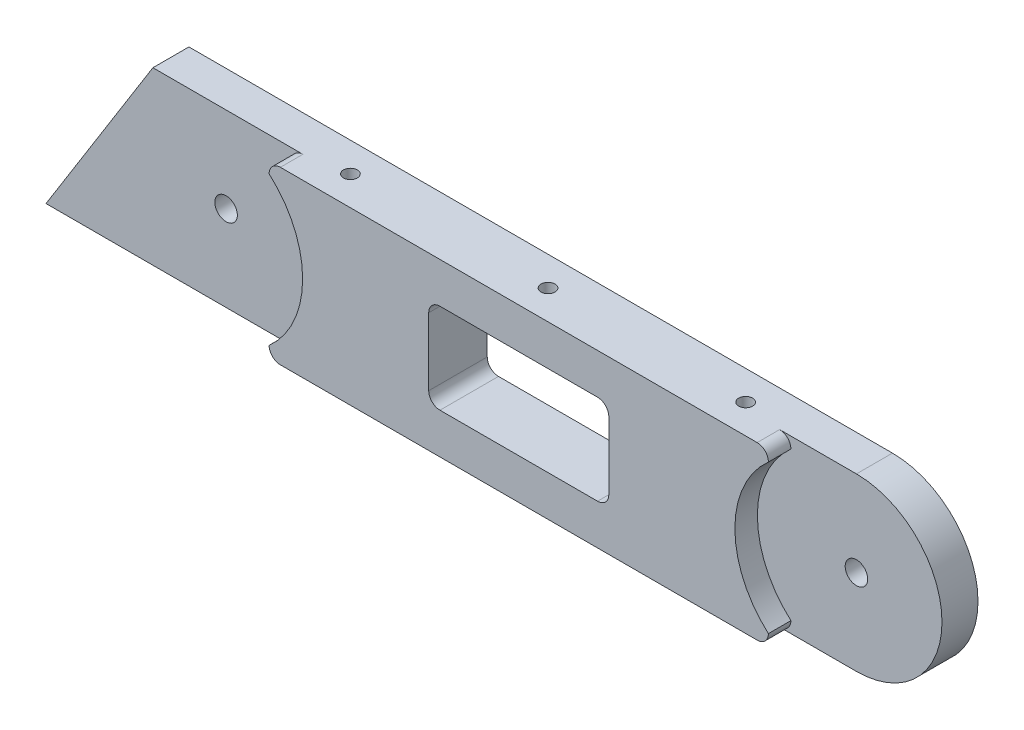
ISO-10303-21;
HEADER;
FILE_DESCRIPTION(('STEP AP214'),'2;1');
FILE_NAME('part.step','',(''),(''),'','','');
FILE_SCHEMA(('AUTOMOTIVE_DESIGN { 1 0 10303 214 1 1 1 1 }'));
ENDSEC;
DATA;
#1=APPLICATION_CONTEXT('core data for automotive mechanical design processes');
#2=APPLICATION_PROTOCOL_DEFINITION('international standard','automotive_design',2000,#1);
#3=PRODUCT_CONTEXT('',#1,'mechanical');
#4=PRODUCT('Part','Part','',(#3));
#5=PRODUCT_RELATED_PRODUCT_CATEGORY('part','',(#4));
#6=PRODUCT_DEFINITION_FORMATION('','',#4);
#7=PRODUCT_DEFINITION_CONTEXT('part definition',#1,'design');
#8=PRODUCT_DEFINITION('design','',#6,#7);
#9=PRODUCT_DEFINITION_SHAPE('','',#8);
#10=(LENGTH_UNIT() NAMED_UNIT(*) SI_UNIT(.MILLI.,.METRE.));
#11=(NAMED_UNIT(*) PLANE_ANGLE_UNIT() SI_UNIT($,.RADIAN.));
#12=(NAMED_UNIT(*) SI_UNIT($,.STERADIAN.) SOLID_ANGLE_UNIT());
#13=UNCERTAINTY_MEASURE_WITH_UNIT(LENGTH_MEASURE(1.E-05),#10,'distance_accuracy_value','');
#14=(GEOMETRIC_REPRESENTATION_CONTEXT(3) GLOBAL_UNCERTAINTY_ASSIGNED_CONTEXT((#13)) GLOBAL_UNIT_ASSIGNED_CONTEXT((#10,
#11,#12)) REPRESENTATION_CONTEXT('',''));
#15=CARTESIAN_POINT('',(0.,0.,0.));
#16=DIRECTION('',(0.,0.,1.));
#17=DIRECTION('',(1.,0.,0.));
#18=AXIS2_PLACEMENT_3D('',#15,#16,#17);
#19=CARTESIAN_POINT('',(-32.9483677891447,16.5,13.));
#20=DIRECTION('',(0.,0.,1.));
#21=DIRECTION('',(1.,0.,0.));
#22=AXIS2_PLACEMENT_3D('',#19,#20,#21);
#23=PLANE('',#22);
#24=CARTESIAN_POINT('',(-50.,0.,13.));
#25=DIRECTION('',(0.,0.,1.));
#26=DIRECTION('',(1.,0.,0.));
#27=AXIS2_PLACEMENT_3D('',#24,#25,#26);
#28=CIRCLE('',#27,22.);
#29=CARTESIAN_POINT('',(-35.4483677891447,-16.5,13.));
#30=VERTEX_POINT('',#29);
#31=CARTESIAN_POINT('',(-35.4483677891447,16.5,13.));
#32=VERTEX_POINT('',#31);
#33=EDGE_CURVE('E182',#30,#32,#28,.T.);
#34=ORIENTED_EDGE('',*,*,#33,.F.);
#35=CARTESIAN_POINT('',(-32.9483677891447,-16.5,13.));
#36=DIRECTION('',(0.,0.,-1.));
#37=DIRECTION('',(-1.,0.,0.));
#38=AXIS2_PLACEMENT_3D('',#35,#36,#37);
#39=CIRCLE('',#38,2.5);
#40=CARTESIAN_POINT('',(-32.9483677891447,-19.,13.));
#41=VERTEX_POINT('',#40);
#42=EDGE_CURVE('E195',#41,#30,#39,.T.);
#43=ORIENTED_EDGE('',*,*,#42,.F.);
#44=DIRECTION('',(1.,0.,0.));
#45=VECTOR('',#44,1.);
#46=CARTESIAN_POINT('',(-32.9483677891447,-19.,13.));
#47=LINE('',#46,#45);
#48=CARTESIAN_POINT('',(72.9483677891448,-19.,13.));
#49=VERTEX_POINT('',#48);
#50=EDGE_CURVE('E204',#41,#49,#47,.T.);
#51=ORIENTED_EDGE('',*,*,#50,.T.);
#52=CARTESIAN_POINT('',(72.9483677891448,-16.5,13.));
#53=DIRECTION('',(0.,0.,1.));
#54=DIRECTION('',(1.,0.,0.));
#55=AXIS2_PLACEMENT_3D('',#52,#53,#54);
#56=CIRCLE('',#55,2.5);
#57=CARTESIAN_POINT('',(75.4483677891448,-16.5,13.));
#58=VERTEX_POINT('',#57);
#59=EDGE_CURVE('E206',#49,#58,#56,.T.);
#60=ORIENTED_EDGE('',*,*,#59,.T.);
#61=CARTESIAN_POINT('',(90.,0.,13.));
#62=DIRECTION('',(0.,0.,1.));
#63=DIRECTION('',(1.,0.,0.));
#64=AXIS2_PLACEMENT_3D('',#61,#62,#63);
#65=CIRCLE('',#64,22.);
#66=CARTESIAN_POINT('',(75.4483677891448,16.5,13.));
#67=VERTEX_POINT('',#66);
#68=EDGE_CURVE('E200',#67,#58,#65,.T.);
#69=ORIENTED_EDGE('',*,*,#68,.F.);
#70=CARTESIAN_POINT('',(72.9483677891448,16.5,13.));
#71=DIRECTION('',(0.,0.,1.));
#72=DIRECTION('',(1.,0.,0.));
#73=AXIS2_PLACEMENT_3D('',#70,#71,#72);
#74=CIRCLE('',#73,2.5);
#75=CARTESIAN_POINT('',(72.9483677891448,19.,13.));
#76=VERTEX_POINT('',#75);
#77=EDGE_CURVE('E214',#67,#76,#74,.T.);
#78=ORIENTED_EDGE('',*,*,#77,.T.);
#79=DIRECTION('',(1.,0.,0.));
#80=VECTOR('',#79,1.);
#81=CARTESIAN_POINT('',(-32.9483677891447,19.,13.));
#82=LINE('',#81,#80);
#83=CARTESIAN_POINT('',(-32.9483677891447,19.,13.));
#84=VERTEX_POINT('',#83);
#85=EDGE_CURVE('E216',#84,#76,#82,.T.);
#86=ORIENTED_EDGE('',*,*,#85,.F.);
#87=CARTESIAN_POINT('',(-32.9483677891447,16.5,13.));
#88=DIRECTION('',(0.,0.,1.));
#89=DIRECTION('',(1.,0.,0.));
#90=AXIS2_PLACEMENT_3D('',#87,#88,#89);
#91=CIRCLE('',#90,2.5);
#92=EDGE_CURVE('E198',#84,#32,#91,.T.);
#93=ORIENTED_EDGE('',*,*,#92,.T.);
#94=EDGE_LOOP('',(#34,#43,#51,#60,#69,#78,#86,#93));
#95=FACE_BOUND('',#94,.T.);
#96=DIRECTION('',(1.,0.,0.));
#97=VECTOR('',#96,1.);
#98=CARTESIAN_POINT('',(2.50000000000002,-10.,13.));
#99=LINE('',#98,#97);
#100=CARTESIAN_POINT('',(2.50000000000002,-10.,13.));
#101=VERTEX_POINT('',#100);
#102=CARTESIAN_POINT('',(37.5,-10.,13.));
#103=VERTEX_POINT('',#102);
#104=EDGE_CURVE('E224',#101,#103,#99,.T.);
#105=ORIENTED_EDGE('',*,*,#104,.F.);
#106=CARTESIAN_POINT('',(2.5,-7.5,13.));
#107=DIRECTION('',(0.,0.,-1.));
#108=DIRECTION('',(-1.,0.,0.));
#109=AXIS2_PLACEMENT_3D('',#106,#107,#108);
#110=CIRCLE('',#109,2.5);
#111=CARTESIAN_POINT('',(0.,-7.49999999999998,13.));
#112=VERTEX_POINT('',#111);
#113=EDGE_CURVE('E441',#101,#112,#110,.T.);
#114=ORIENTED_EDGE('',*,*,#113,.T.);
#115=DIRECTION('',(0.,1.,0.));
#116=VECTOR('',#115,1.);
#117=CARTESIAN_POINT('',(0.,-7.49999999999998,13.));
#118=LINE('',#117,#116);
#119=CARTESIAN_POINT('',(0.,7.49999999999998,13.));
#120=VERTEX_POINT('',#119);
#121=EDGE_CURVE('E444',#112,#120,#118,.T.);
#122=ORIENTED_EDGE('',*,*,#121,.T.);
#123=CARTESIAN_POINT('',(2.5,7.5,13.));
#124=DIRECTION('',(0.,0.,1.));
#125=DIRECTION('',(1.,0.,0.));
#126=AXIS2_PLACEMENT_3D('',#123,#124,#125);
#127=CIRCLE('',#126,2.5);
#128=CARTESIAN_POINT('',(2.50000000000002,10.,13.));
#129=VERTEX_POINT('',#128);
#130=EDGE_CURVE('E448',#129,#120,#127,.T.);
#131=ORIENTED_EDGE('',*,*,#130,.F.);
#132=DIRECTION('',(1.,0.,0.));
#133=VECTOR('',#132,1.);
#134=CARTESIAN_POINT('',(2.50000000000002,10.,13.));
#135=LINE('',#134,#133);
#136=CARTESIAN_POINT('',(37.5,10.,13.));
#137=VERTEX_POINT('',#136);
#138=EDGE_CURVE('E451',#129,#137,#135,.T.);
#139=ORIENTED_EDGE('',*,*,#138,.T.);
#140=CARTESIAN_POINT('',(37.5,7.5,13.));
#141=DIRECTION('',(0.,0.,1.));
#142=DIRECTION('',(1.,0.,0.));
#143=AXIS2_PLACEMENT_3D('',#140,#141,#142);
#144=CIRCLE('',#143,2.5);
#145=CARTESIAN_POINT('',(40.,7.49999999999998,13.));
#146=VERTEX_POINT('',#145);
#147=EDGE_CURVE('E454',#146,#137,#144,.T.);
#148=ORIENTED_EDGE('',*,*,#147,.F.);
#149=DIRECTION('',(0.,1.,0.));
#150=VECTOR('',#149,1.);
#151=CARTESIAN_POINT('',(40.,-7.49999999999998,13.));
#152=LINE('',#151,#150);
#153=CARTESIAN_POINT('',(40.,-7.49999999999998,13.));
#154=VERTEX_POINT('',#153);
#155=EDGE_CURVE('E457',#154,#146,#152,.T.);
#156=ORIENTED_EDGE('',*,*,#155,.F.);
#157=CARTESIAN_POINT('',(37.5,-7.5,13.));
#158=DIRECTION('',(0.,0.,1.));
#159=DIRECTION('',(1.,0.,0.));
#160=AXIS2_PLACEMENT_3D('',#157,#158,#159);
#161=CIRCLE('',#160,2.5);
#162=EDGE_CURVE('E460',#103,#154,#161,.T.);
#163=ORIENTED_EDGE('',*,*,#162,.F.);
#164=EDGE_LOOP('',(#105,#114,#122,#131,#139,#148,#156,#163));
#165=FACE_BOUND('',#164,.T.);
#166=ADVANCED_FACE('F39',(#95,#165),#23,.T.);
#167=CARTESIAN_POINT('',(0.,0.,8.));
#168=DIRECTION('',(0.,0.,1.));
#169=DIRECTION('',(1.,0.,0.));
#170=AXIS2_PLACEMENT_3D('',#167,#168,#169);
#171=PLANE('',#170);
#172=CARTESIAN_POINT('',(72.9483677891448,-16.5,8.));
#173=DIRECTION('',(0.,0.,1.));
#174=DIRECTION('',(1.,0.,0.));
#175=AXIS2_PLACEMENT_3D('',#172,#173,#174);
#176=CIRCLE('',#175,2.5);
#177=CARTESIAN_POINT('',(72.9483677891448,-19.,8.));
#178=VERTEX_POINT('',#177);
#179=CARTESIAN_POINT('',(75.4483677891448,-16.5,8.));
#180=VERTEX_POINT('',#179);
#181=EDGE_CURVE('E226',#178,#180,#176,.T.);
#182=ORIENTED_EDGE('',*,*,#181,.F.);
#183=DIRECTION('',(-1.,0.,0.));
#184=VECTOR('',#183,1.);
#185=CARTESIAN_POINT('',(0.,-19.,8.));
#186=LINE('',#185,#184);
#187=CARTESIAN_POINT('',(90.,-19.,8.));
#188=VERTEX_POINT('',#187);
#189=EDGE_CURVE('E257',#188,#178,#186,.T.);
#190=ORIENTED_EDGE('',*,*,#189,.F.);
#191=CARTESIAN_POINT('',(90.,0.,8.));
#192=DIRECTION('',(0.,0.,1.));
#193=DIRECTION('',(1.,0.,0.));
#194=AXIS2_PLACEMENT_3D('',#191,#192,#193);
#195=CIRCLE('',#194,19.);
#196=CARTESIAN_POINT('',(90.,19.,8.));
#197=VERTEX_POINT('',#196);
#198=EDGE_CURVE('E247',#188,#197,#195,.T.);
#199=ORIENTED_EDGE('',*,*,#198,.T.);
#200=DIRECTION('',(-1.,0.,0.));
#201=VECTOR('',#200,1.);
#202=CARTESIAN_POINT('',(0.,19.,8.));
#203=LINE('',#202,#201);
#204=CARTESIAN_POINT('',(72.9483677891448,19.,8.));
#205=VERTEX_POINT('',#204);
#206=EDGE_CURVE('E252',#197,#205,#203,.T.);
#207=ORIENTED_EDGE('',*,*,#206,.T.);
#208=CARTESIAN_POINT('',(72.9483677891448,16.5,8.));
#209=DIRECTION('',(0.,0.,1.));
#210=DIRECTION('',(1.,0.,0.));
#211=AXIS2_PLACEMENT_3D('',#208,#209,#210);
#212=CIRCLE('',#211,2.5);
#213=CARTESIAN_POINT('',(75.4483677891448,16.5,8.));
#214=VERTEX_POINT('',#213);
#215=EDGE_CURVE('E208',#214,#205,#212,.T.);
#216=ORIENTED_EDGE('',*,*,#215,.F.);
#217=CARTESIAN_POINT('',(90.,0.,8.));
#218=DIRECTION('',(0.,0.,1.));
#219=DIRECTION('',(1.,0.,0.));
#220=AXIS2_PLACEMENT_3D('',#217,#218,#219);
#221=CIRCLE('',#220,22.);
#222=EDGE_CURVE('E880',#214,#180,#221,.T.);
#223=ORIENTED_EDGE('',*,*,#222,.T.);
#224=EDGE_LOOP('',(#182,#190,#199,#207,#216,#223));
#225=FACE_BOUND('',#224,.T.);
#226=CARTESIAN_POINT('',(90.,0.,8.));
#227=DIRECTION('',(0.,0.,1.));
#228=DIRECTION('',(1.,0.,0.));
#229=AXIS2_PLACEMENT_3D('',#226,#227,#228);
#230=CIRCLE('',#229,2.50000000000001);
#231=CARTESIAN_POINT('',(92.5,0.,8.));
#232=VERTEX_POINT('',#231);
#233=EDGE_CURVE('E262',#232,#232,#230,.T.);
#234=ORIENTED_EDGE('',*,*,#233,.F.);
#235=EDGE_LOOP('',(#234));
#236=FACE_BOUND('',#235,.T.);
#237=ADVANCED_FACE('F352',(#225,#236),#171,.T.);
#238=CARTESIAN_POINT('',(2.50000000000006,7.50000000000002,8.));
#239=DIRECTION('',(0.,0.,-1.));
#240=DIRECTION('',(-1.,0.,0.));
#241=AXIS2_PLACEMENT_3D('',#238,#239,#240);
#242=CYLINDRICAL_SURFACE('',#241,2.5);
#243=CARTESIAN_POINT('',(2.50000000000006,7.50000000000002,0.));
#244=DIRECTION('',(0.,0.,1.));
#245=DIRECTION('',(1.,0.,0.));
#246=AXIS2_PLACEMENT_3D('',#243,#244,#245);
#247=CIRCLE('',#246,2.5);
#248=CARTESIAN_POINT('',(2.50000000000007,10.,0.));
#249=VERTEX_POINT('',#248);
#250=CARTESIAN_POINT('',(0.,7.5,0.));
#251=VERTEX_POINT('',#250);
#252=EDGE_CURVE('E277',#249,#251,#247,.T.);
#253=ORIENTED_EDGE('',*,*,#252,.F.);
#254=DIRECTION('',(0.,0.,-1.));
#255=VECTOR('',#254,1.);
#256=CARTESIAN_POINT('',(2.50000000000007,10.,8.));
#257=LINE('',#256,#255);
#258=EDGE_CURVE('E11',#129,#249,#257,.T.);
#259=ORIENTED_EDGE('',*,*,#258,.F.);
#260=ORIENTED_EDGE('',*,*,#130,.T.);
#261=DIRECTION('',(0.,0.,-1.));
#262=VECTOR('',#261,1.);
#263=CARTESIAN_POINT('',(0.,7.5,8.));
#264=LINE('',#263,#262);
#265=EDGE_CURVE('E305',#120,#251,#264,.T.);
#266=ORIENTED_EDGE('',*,*,#265,.T.);
#267=EDGE_LOOP('',(#253,#259,#260,#266));
#268=FACE_BOUND('',#267,.T.);
#269=ADVANCED_FACE('F357',(#268),#242,.F.);
#270=CARTESIAN_POINT('',(0.,10.,8.));
#271=DIRECTION('',(0.,-1.,0.));
#272=DIRECTION('',(0.,0.,-1.));
#273=AXIS2_PLACEMENT_3D('',#270,#271,#272);
#274=PLANE('',#273);
#275=DIRECTION('',(-1.,0.,0.));
#276=VECTOR('',#275,1.);
#277=CARTESIAN_POINT('',(0.,10.,0.));
#278=LINE('',#277,#276);
#279=CARTESIAN_POINT('',(37.5,10.,0.));
#280=VERTEX_POINT('',#279);
#281=EDGE_CURVE('E280',#280,#249,#278,.T.);
#282=ORIENTED_EDGE('',*,*,#281,.F.);
#283=DIRECTION('',(0.,0.,-1.));
#284=VECTOR('',#283,1.);
#285=CARTESIAN_POINT('',(37.5,10.,8.));
#286=LINE('',#285,#284);
#287=EDGE_CURVE('E48',#137,#280,#286,.T.);
#288=ORIENTED_EDGE('',*,*,#287,.F.);
#289=ORIENTED_EDGE('',*,*,#138,.F.);
#290=ORIENTED_EDGE('',*,*,#258,.T.);
#291=EDGE_LOOP('',(#282,#288,#289,#290));
#292=FACE_BOUND('',#291,.T.);
#293=ADVANCED_FACE('F408',(#292),#274,.T.);
#294=CARTESIAN_POINT('',(37.5000000000001,7.50000000000002,8.));
#295=DIRECTION('',(0.,0.,-1.));
#296=DIRECTION('',(-1.,0.,0.));
#297=AXIS2_PLACEMENT_3D('',#294,#295,#296);
#298=CYLINDRICAL_SURFACE('',#297,2.5);
#299=CARTESIAN_POINT('',(37.5000000000001,7.50000000000002,0.));
#300=DIRECTION('',(0.,0.,1.));
#301=DIRECTION('',(1.,0.,0.));
#302=AXIS2_PLACEMENT_3D('',#299,#300,#301);
#303=CIRCLE('',#302,2.5);
#304=CARTESIAN_POINT('',(40.0000000000001,7.5,0.));
#305=VERTEX_POINT('',#304);
#306=EDGE_CURVE('E283',#305,#280,#303,.T.);
#307=ORIENTED_EDGE('',*,*,#306,.F.);
#308=DIRECTION('',(0.,0.,-1.));
#309=VECTOR('',#308,1.);
#310=CARTESIAN_POINT('',(40.0000000000001,7.5,8.));
#311=LINE('',#310,#309);
#312=EDGE_CURVE('E315',#146,#305,#311,.T.);
#313=ORIENTED_EDGE('',*,*,#312,.F.);
#314=ORIENTED_EDGE('',*,*,#147,.T.);
#315=ORIENTED_EDGE('',*,*,#287,.T.);
#316=EDGE_LOOP('',(#307,#313,#314,#315));
#317=FACE_BOUND('',#316,.T.);
#318=ADVANCED_FACE('F404',(#317),#298,.F.);
#319=CARTESIAN_POINT('',(40.0000000000001,0.,8.));
#320=DIRECTION('',(-1.,0.,0.));
#321=DIRECTION('',(0.,0.,1.));
#322=AXIS2_PLACEMENT_3D('',#319,#320,#321);
#323=PLANE('',#322);
#324=DIRECTION('',(0.,1.,0.));
#325=VECTOR('',#324,1.);
#326=CARTESIAN_POINT('',(40.0000000000001,0.,0.));
#327=LINE('',#326,#325);
#328=CARTESIAN_POINT('',(40.0000000000001,-7.49999999999995,0.));
#329=VERTEX_POINT('',#328);
#330=EDGE_CURVE('E286',#329,#305,#327,.T.);
#331=ORIENTED_EDGE('',*,*,#330,.F.);
#332=DIRECTION('',(0.,0.,-1.));
#333=VECTOR('',#332,1.);
#334=CARTESIAN_POINT('',(40.0000000000001,-7.49999999999995,8.));
#335=LINE('',#334,#333);
#336=EDGE_CURVE('E313',#154,#329,#335,.T.);
#337=ORIENTED_EDGE('',*,*,#336,.F.);
#338=ORIENTED_EDGE('',*,*,#155,.T.);
#339=ORIENTED_EDGE('',*,*,#312,.T.);
#340=EDGE_LOOP('',(#331,#337,#338,#339));
#341=FACE_BOUND('',#340,.T.);
#342=ADVANCED_FACE('F400',(#341),#323,.T.);
#343=CARTESIAN_POINT('',(37.5000000000001,-7.49999999999997,8.));
#344=DIRECTION('',(0.,0.,-1.));
#345=DIRECTION('',(-1.,0.,0.));
#346=AXIS2_PLACEMENT_3D('',#343,#344,#345);
#347=CYLINDRICAL_SURFACE('',#346,2.5);
#348=CARTESIAN_POINT('',(37.5000000000001,-7.49999999999997,0.));
#349=DIRECTION('',(0.,0.,1.));
#350=DIRECTION('',(1.,0.,0.));
#351=AXIS2_PLACEMENT_3D('',#348,#349,#350);
#352=CIRCLE('',#351,2.5);
#353=CARTESIAN_POINT('',(37.5,-9.99999999999997,0.));
#354=VERTEX_POINT('',#353);
#355=EDGE_CURVE('E289',#354,#329,#352,.T.);
#356=ORIENTED_EDGE('',*,*,#355,.F.);
#357=DIRECTION('',(0.,0.,-1.));
#358=VECTOR('',#357,1.);
#359=CARTESIAN_POINT('',(37.5,-9.99999999999997,8.));
#360=LINE('',#359,#358);
#361=EDGE_CURVE('E311',#103,#354,#360,.T.);
#362=ORIENTED_EDGE('',*,*,#361,.F.);
#363=ORIENTED_EDGE('',*,*,#162,.T.);
#364=ORIENTED_EDGE('',*,*,#336,.T.);
#365=EDGE_LOOP('',(#356,#362,#363,#364));
#366=FACE_BOUND('',#365,.T.);
#367=ADVANCED_FACE('F397',(#366),#347,.F.);
#368=CARTESIAN_POINT('',(0.,-9.99999999999997,8.));
#369=DIRECTION('',(0.,-1.,0.));
#370=DIRECTION('',(0.,0.,-1.));
#371=AXIS2_PLACEMENT_3D('',#368,#369,#370);
#372=PLANE('',#371);
#373=DIRECTION('',(-1.,0.,0.));
#374=VECTOR('',#373,1.);
#375=CARTESIAN_POINT('',(0.,-9.99999999999997,0.));
#376=LINE('',#375,#374);
#377=CARTESIAN_POINT('',(2.50000000000007,-9.99999999999997,0.));
#378=VERTEX_POINT('',#377);
#379=EDGE_CURVE('E292',#354,#378,#376,.T.);
#380=ORIENTED_EDGE('',*,*,#379,.T.);
#381=DIRECTION('',(0.,0.,-1.));
#382=VECTOR('',#381,1.);
#383=CARTESIAN_POINT('',(2.50000000000007,-9.99999999999997,8.));
#384=LINE('',#383,#382);
#385=EDGE_CURVE('E56',#101,#378,#384,.T.);
#386=ORIENTED_EDGE('',*,*,#385,.F.);
#387=ORIENTED_EDGE('',*,*,#104,.T.);
#388=ORIENTED_EDGE('',*,*,#361,.T.);
#389=EDGE_LOOP('',(#380,#386,#387,#388));
#390=FACE_BOUND('',#389,.T.);
#391=ADVANCED_FACE('F393',(#390),#372,.F.);
#392=CARTESIAN_POINT('',(2.50000000000006,-7.49999999999997,8.));
#393=DIRECTION('',(0.,0.,-1.));
#394=DIRECTION('',(-1.,0.,0.));
#395=AXIS2_PLACEMENT_3D('',#392,#393,#394);
#396=CYLINDRICAL_SURFACE('',#395,2.5);
#397=CARTESIAN_POINT('',(2.50000000000006,-7.49999999999997,0.));
#398=DIRECTION('',(0.,0.,1.));
#399=DIRECTION('',(1.,0.,0.));
#400=AXIS2_PLACEMENT_3D('',#397,#398,#399);
#401=CIRCLE('',#400,2.5);
#402=CARTESIAN_POINT('',(0.,-7.49999999999995,0.));
#403=VERTEX_POINT('',#402);
#404=EDGE_CURVE('E294',#378,#403,#401,.F.);
#405=ORIENTED_EDGE('',*,*,#404,.T.);
#406=DIRECTION('',(0.,0.,-1.));
#407=VECTOR('',#406,1.);
#408=CARTESIAN_POINT('',(0.,-7.49999999999995,8.));
#409=LINE('',#408,#407);
#410=EDGE_CURVE('E307',#112,#403,#409,.T.);
#411=ORIENTED_EDGE('',*,*,#410,.F.);
#412=ORIENTED_EDGE('',*,*,#113,.F.);
#413=ORIENTED_EDGE('',*,*,#385,.T.);
#414=EDGE_LOOP('',(#405,#411,#412,#413));
#415=FACE_BOUND('',#414,.T.);
#416=ADVANCED_FACE('F390',(#415),#396,.F.);
#417=CARTESIAN_POINT('',(90.,0.,8.));
#418=DIRECTION('',(0.,0.,-1.));
#419=DIRECTION('',(-1.,0.,0.));
#420=AXIS2_PLACEMENT_3D('',#417,#418,#419);
#421=CYLINDRICAL_SURFACE('',#420,19.);
#422=CARTESIAN_POINT('',(90.,0.,0.));
#423=DIRECTION('',(0.,0.,1.));
#424=DIRECTION('',(1.,0.,0.));
#425=AXIS2_PLACEMENT_3D('',#422,#423,#424);
#426=CIRCLE('',#425,19.);
#427=CARTESIAN_POINT('',(90.,-19.,0.));
#428=VERTEX_POINT('',#427);
#429=CARTESIAN_POINT('',(90.,19.,0.));
#430=VERTEX_POINT('',#429);
#431=EDGE_CURVE('E246',#428,#430,#426,.T.);
#432=ORIENTED_EDGE('',*,*,#431,.T.);
#433=DIRECTION('',(0.,0.,-1.));
#434=VECTOR('',#433,1.);
#435=CARTESIAN_POINT('',(90.,19.,8.));
#436=LINE('',#435,#434);
#437=EDGE_CURVE('E43',#197,#430,#436,.T.);
#438=ORIENTED_EDGE('',*,*,#437,.F.);
#439=ORIENTED_EDGE('',*,*,#198,.F.);
#440=DIRECTION('',(0.,0.,-1.));
#441=VECTOR('',#440,1.);
#442=CARTESIAN_POINT('',(90.,-19.,8.));
#443=LINE('',#442,#441);
#444=EDGE_CURVE('E265',#188,#428,#443,.T.);
#445=ORIENTED_EDGE('',*,*,#444,.T.);
#446=EDGE_LOOP('',(#432,#438,#439,#445));
#447=FACE_BOUND('',#446,.T.);
#448=ADVANCED_FACE('F41',(#447),#421,.T.);
#449=CARTESIAN_POINT('',(0.,19.,8.));
#450=DIRECTION('',(0.,-1.,0.));
#451=DIRECTION('',(1.,0.,0.));
#452=AXIS2_PLACEMENT_3D('',#449,#450,#451);
#453=PLANE('',#452);
#454=CARTESIAN_POINT('',(-23.89,19.,6.5));
#455=DIRECTION('',(0.,1.,0.));
#456=DIRECTION('',(-1.,0.,0.));
#457=AXIS2_PLACEMENT_3D('',#454,#455,#456);
#458=CIRCLE('',#457,1.55);
#459=CARTESIAN_POINT('',(-25.44,19.,6.5));
#460=VERTEX_POINT('',#459);
#461=EDGE_CURVE('E896',#460,#460,#458,.T.);
#462=ORIENTED_EDGE('',*,*,#461,.F.);
#463=EDGE_LOOP('',(#462));
#464=FACE_BOUND('',#463,.T.);
#465=CARTESIAN_POINT('',(20.,19.,6.5));
#466=DIRECTION('',(0.,1.,0.));
#467=DIRECTION('',(-1.,0.,0.));
#468=AXIS2_PLACEMENT_3D('',#465,#466,#467);
#469=CIRCLE('',#468,1.55);
#470=CARTESIAN_POINT('',(18.45,19.,6.5));
#471=VERTEX_POINT('',#470);
#472=EDGE_CURVE('E899',#471,#471,#469,.T.);
#473=ORIENTED_EDGE('',*,*,#472,.F.);
#474=EDGE_LOOP('',(#473));
#475=FACE_BOUND('',#474,.T.);
#476=CARTESIAN_POINT('',(63.89,19.,6.5));
#477=DIRECTION('',(0.,1.,0.));
#478=DIRECTION('',(-1.,0.,0.));
#479=AXIS2_PLACEMENT_3D('',#476,#477,#478);
#480=CIRCLE('',#479,1.54999999999999);
#481=CARTESIAN_POINT('',(62.34,19.,6.5));
#482=VERTEX_POINT('',#481);
#483=EDGE_CURVE('E891',#482,#482,#480,.T.);
#484=ORIENTED_EDGE('',*,*,#483,.F.);
#485=EDGE_LOOP('',(#484));
#486=FACE_BOUND('',#485,.T.);
#487=DIRECTION('',(-1.,0.,0.));
#488=VECTOR('',#487,1.);
#489=CARTESIAN_POINT('',(0.,19.,0.));
#490=LINE('',#489,#488);
#491=CARTESIAN_POINT('',(-66.2549646274453,19.,0.));
#492=VERTEX_POINT('',#491);
#493=EDGE_CURVE('E268',#430,#492,#490,.T.);
#494=ORIENTED_EDGE('',*,*,#493,.T.);
#495=DIRECTION('',(0.,0.,-1.));
#496=VECTOR('',#495,1.);
#497=CARTESIAN_POINT('',(-66.2549646274453,19.,8.));
#498=LINE('',#497,#496);
#499=CARTESIAN_POINT('',(-66.2549646274453,19.,8.));
#500=VERTEX_POINT('',#499);
#501=EDGE_CURVE('E320',#500,#492,#498,.T.);
#502=ORIENTED_EDGE('',*,*,#501,.F.);
#503=CARTESIAN_POINT('',(-32.9483677891447,19.,8.));
#504=VERTEX_POINT('',#503);
#505=EDGE_CURVE('E250',#504,#500,#203,.T.);
#506=ORIENTED_EDGE('',*,*,#505,.F.);
#507=DIRECTION('',(0.,0.,-1.));
#508=VECTOR('',#507,1.);
#509=CARTESIAN_POINT('',(-32.9483677891447,19.,13.));
#510=LINE('',#509,#508);
#511=EDGE_CURVE('E219',#84,#504,#510,.T.);
#512=ORIENTED_EDGE('',*,*,#511,.F.);
#513=ORIENTED_EDGE('',*,*,#85,.T.);
#514=DIRECTION('',(0.,0.,-1.));
#515=VECTOR('',#514,1.);
#516=CARTESIAN_POINT('',(72.9483677891448,19.,13.));
#517=LINE('',#516,#515);
#518=EDGE_CURVE('E233',#76,#205,#517,.T.);
#519=ORIENTED_EDGE('',*,*,#518,.T.);
#520=ORIENTED_EDGE('',*,*,#206,.F.);
#521=ORIENTED_EDGE('',*,*,#437,.T.);
#522=EDGE_LOOP('',(#494,#502,#506,#512,#513,#519,#520,#521));
#523=FACE_BOUND('',#522,.T.);
#524=ADVANCED_FACE('F327',(#464,#475,#486,#523),#453,.F.);
#525=CARTESIAN_POINT('',(-56.188158165666,35.1102579779588,8.));
#526=DIRECTION('',(-0.848048096156424,0.529919264233208,0.));
#527=DIRECTION('',(-0.529919264233208,-0.848048096156424,0.));
#528=AXIS2_PLACEMENT_3D('',#525,#526,#527);
#529=PLANE('',#528);
#530=DIRECTION('',(0.529919264233208,0.848048096156424,0.));
#531=VECTOR('',#530,1.);
#532=CARTESIAN_POINT('',(-56.188158165666,35.1102579779588,0.));
#533=LINE('',#532,#531);
#534=CARTESIAN_POINT('',(-90.,-19.,0.));
#535=VERTEX_POINT('',#534);
#536=EDGE_CURVE('E271',#535,#492,#533,.T.);
#537=ORIENTED_EDGE('',*,*,#536,.F.);
#538=DIRECTION('',(0.,0.,-1.));
#539=VECTOR('',#538,1.);
#540=CARTESIAN_POINT('',(-90.,-19.,8.));
#541=LINE('',#540,#539);
#542=CARTESIAN_POINT('',(-90.,-19.,8.));
#543=VERTEX_POINT('',#542);
#544=EDGE_CURVE('E319',#543,#535,#541,.T.);
#545=ORIENTED_EDGE('',*,*,#544,.F.);
#546=DIRECTION('',(0.529919264233208,0.848048096156424,0.));
#547=VECTOR('',#546,1.);
#548=CARTESIAN_POINT('',(-56.188158165666,35.1102579779588,8.));
#549=LINE('',#548,#547);
#550=EDGE_CURVE('E254',#543,#500,#549,.T.);
#551=ORIENTED_EDGE('',*,*,#550,.T.);
#552=ORIENTED_EDGE('',*,*,#501,.T.);
#553=EDGE_LOOP('',(#537,#545,#551,#552));
#554=FACE_BOUND('',#553,.T.);
#555=ADVANCED_FACE('F338',(#554),#529,.T.);
#556=CARTESIAN_POINT('',(-50.,0.,8.));
#557=DIRECTION('',(0.,0.,-1.));
#558=DIRECTION('',(-1.,0.,0.));
#559=AXIS2_PLACEMENT_3D('',#556,#557,#558);
#560=CYLINDRICAL_SURFACE('',#559,2.5);
#561=CARTESIAN_POINT('',(-50.,0.,8.));
#562=DIRECTION('',(0.,0.,1.));
#563=DIRECTION('',(1.,0.,0.));
#564=AXIS2_PLACEMENT_3D('',#561,#562,#563);
#565=CIRCLE('',#564,2.5);
#566=CARTESIAN_POINT('',(-47.5,0.,8.));
#567=VERTEX_POINT('',#566);
#568=EDGE_CURVE('E259',#567,#567,#565,.T.);
#569=ORIENTED_EDGE('',*,*,#568,.T.);
#570=EDGE_LOOP('',(#569));
#571=FACE_BOUND('',#570,.T.);
#572=CARTESIAN_POINT('',(-50.,0.,0.));
#573=DIRECTION('',(0.,0.,1.));
#574=DIRECTION('',(1.,0.,0.));
#575=AXIS2_PLACEMENT_3D('',#572,#573,#574);
#576=CIRCLE('',#575,2.5);
#577=CARTESIAN_POINT('',(-47.5,0.,0.));
#578=VERTEX_POINT('',#577);
#579=EDGE_CURVE('E300',#578,#578,#576,.T.);
#580=ORIENTED_EDGE('',*,*,#579,.F.);
#581=EDGE_LOOP('',(#580));
#582=FACE_BOUND('',#581,.T.);
#583=ADVANCED_FACE('F340',(#571,#582),#560,.F.);
#584=CARTESIAN_POINT('',(0.,0.,8.));
#585=DIRECTION('',(-1.,0.,0.));
#586=DIRECTION('',(0.,0.,1.));
#587=AXIS2_PLACEMENT_3D('',#584,#585,#586);
#588=PLANE('',#587);
#589=DIRECTION('',(0.,1.,0.));
#590=VECTOR('',#589,1.);
#591=CARTESIAN_POINT('',(0.,0.,0.));
#592=LINE('',#591,#590);
#593=EDGE_CURVE('E297',#403,#251,#592,.T.);
#594=ORIENTED_EDGE('',*,*,#593,.T.);
#595=ORIENTED_EDGE('',*,*,#265,.F.);
#596=ORIENTED_EDGE('',*,*,#121,.F.);
#597=ORIENTED_EDGE('',*,*,#410,.T.);
#598=EDGE_LOOP('',(#594,#595,#596,#597));
#599=FACE_BOUND('',#598,.T.);
#600=ADVANCED_FACE('F346',(#599),#588,.F.);
#601=CARTESIAN_POINT('',(0.,-19.,8.));
#602=DIRECTION('',(0.,-1.,0.));
#603=DIRECTION('',(1.,0.,0.));
#604=AXIS2_PLACEMENT_3D('',#601,#602,#603);
#605=PLANE('',#604);
#606=CARTESIAN_POINT('',(-23.89,-19.,6.5));
#607=DIRECTION('',(0.,-1.,0.));
#608=DIRECTION('',(1.,0.,0.));
#609=AXIS2_PLACEMENT_3D('',#606,#607,#608);
#610=CIRCLE('',#609,1.55);
#611=CARTESIAN_POINT('',(-22.34,-19.,6.5));
#612=VERTEX_POINT('',#611);
#613=EDGE_CURVE('E422',#612,#612,#610,.T.);
#614=ORIENTED_EDGE('',*,*,#613,.F.);
#615=EDGE_LOOP('',(#614));
#616=FACE_BOUND('',#615,.T.);
#617=CARTESIAN_POINT('',(20.,-19.,6.5));
#618=DIRECTION('',(0.,-1.,0.));
#619=DIRECTION('',(1.,0.,0.));
#620=AXIS2_PLACEMENT_3D('',#617,#618,#619);
#621=CIRCLE('',#620,1.55);
#622=CARTESIAN_POINT('',(21.55,-19.,6.5));
#623=VERTEX_POINT('',#622);
#624=EDGE_CURVE('E426',#623,#623,#621,.T.);
#625=ORIENTED_EDGE('',*,*,#624,.F.);
#626=EDGE_LOOP('',(#625));
#627=FACE_BOUND('',#626,.T.);
#628=CARTESIAN_POINT('',(63.89,-19.,6.5));
#629=DIRECTION('',(0.,-1.,0.));
#630=DIRECTION('',(1.,0.,0.));
#631=AXIS2_PLACEMENT_3D('',#628,#629,#630);
#632=CIRCLE('',#631,1.54999999999999);
#633=CARTESIAN_POINT('',(65.44,-19.,6.5));
#634=VERTEX_POINT('',#633);
#635=EDGE_CURVE('E429',#634,#634,#632,.T.);
#636=ORIENTED_EDGE('',*,*,#635,.F.);
#637=EDGE_LOOP('',(#636));
#638=FACE_BOUND('',#637,.T.);
#639=DIRECTION('',(-1.,0.,0.));
#640=VECTOR('',#639,1.);
#641=CARTESIAN_POINT('',(0.,-19.,0.));
#642=LINE('',#641,#640);
#643=EDGE_CURVE('E274',#428,#535,#642,.T.);
#644=ORIENTED_EDGE('',*,*,#643,.F.);
#645=ORIENTED_EDGE('',*,*,#444,.F.);
#646=ORIENTED_EDGE('',*,*,#189,.T.);
#647=DIRECTION('',(0.,0.,-1.));
#648=VECTOR('',#647,1.);
#649=CARTESIAN_POINT('',(72.9483677891448,-19.,13.));
#650=LINE('',#649,#648);
#651=EDGE_CURVE('E241',#49,#178,#650,.T.);
#652=ORIENTED_EDGE('',*,*,#651,.F.);
#653=ORIENTED_EDGE('',*,*,#50,.F.);
#654=DIRECTION('',(0.,0.,-1.));
#655=VECTOR('',#654,1.);
#656=CARTESIAN_POINT('',(-32.9483677891447,-19.,13.));
#657=LINE('',#656,#655);
#658=CARTESIAN_POINT('',(-32.9483677891447,-19.,8.));
#659=VERTEX_POINT('',#658);
#660=EDGE_CURVE('E190',#41,#659,#657,.T.);
#661=ORIENTED_EDGE('',*,*,#660,.T.);
#662=EDGE_CURVE('E64',#659,#543,#186,.T.);
#663=ORIENTED_EDGE('',*,*,#662,.T.);
#664=ORIENTED_EDGE('',*,*,#544,.T.);
#665=EDGE_LOOP('',(#644,#645,#646,#652,#653,#661,#663,#664));
#666=FACE_BOUND('',#665,.T.);
#667=ADVANCED_FACE('F336',(#616,#627,#638,#666),#605,.T.);
#668=CARTESIAN_POINT('',(90.,0.,8.));
#669=DIRECTION('',(0.,0.,-1.));
#670=DIRECTION('',(-1.,0.,0.));
#671=AXIS2_PLACEMENT_3D('',#668,#669,#670);
#672=CYLINDRICAL_SURFACE('',#671,2.50000000000001);
#673=ORIENTED_EDGE('',*,*,#233,.T.);
#674=EDGE_LOOP('',(#673));
#675=FACE_BOUND('',#674,.T.);
#676=CARTESIAN_POINT('',(90.,0.,0.));
#677=DIRECTION('',(0.,0.,1.));
#678=DIRECTION('',(1.,0.,0.));
#679=AXIS2_PLACEMENT_3D('',#676,#677,#678);
#680=CIRCLE('',#679,2.50000000000001);
#681=CARTESIAN_POINT('',(92.5,0.,0.));
#682=VERTEX_POINT('',#681);
#683=EDGE_CURVE('E251',#682,#682,#680,.T.);
#684=ORIENTED_EDGE('',*,*,#683,.F.);
#685=EDGE_LOOP('',(#684));
#686=FACE_BOUND('',#685,.T.);
#687=ADVANCED_FACE('F381',(#675,#686),#672,.F.);
#688=CARTESIAN_POINT('',(-32.9483677891447,-16.5,8.));
#689=DIRECTION('',(0.,0.,-1.));
#690=DIRECTION('',(-1.,0.,0.));
#691=AXIS2_PLACEMENT_3D('',#688,#689,#690);
#692=CIRCLE('',#691,2.5);
#693=CARTESIAN_POINT('',(-35.4483677891447,-16.5,8.));
#694=VERTEX_POINT('',#693);
#695=EDGE_CURVE('E223',#659,#694,#692,.T.);
#696=ORIENTED_EDGE('',*,*,#695,.T.);
#697=CARTESIAN_POINT('',(-50.,0.,8.));
#698=DIRECTION('',(0.,0.,1.));
#699=DIRECTION('',(1.,0.,0.));
#700=AXIS2_PLACEMENT_3D('',#697,#698,#699);
#701=CIRCLE('',#700,22.);
#702=CARTESIAN_POINT('',(-35.4483677891447,16.5,8.));
#703=VERTEX_POINT('',#702);
#704=EDGE_CURVE('E185',#694,#703,#701,.T.);
#705=ORIENTED_EDGE('',*,*,#704,.T.);
#706=CARTESIAN_POINT('',(-32.9483677891447,16.5,8.));
#707=DIRECTION('',(0.,0.,1.));
#708=DIRECTION('',(1.,0.,0.));
#709=AXIS2_PLACEMENT_3D('',#706,#707,#708);
#710=CIRCLE('',#709,2.5);
#711=EDGE_CURVE('E220',#504,#703,#710,.T.);
#712=ORIENTED_EDGE('',*,*,#711,.F.);
#713=ORIENTED_EDGE('',*,*,#505,.T.);
#714=ORIENTED_EDGE('',*,*,#550,.F.);
#715=ORIENTED_EDGE('',*,*,#662,.F.);
#716=EDGE_LOOP('',(#696,#705,#712,#713,#714,#715));
#717=FACE_BOUND('',#716,.T.);
#718=ORIENTED_EDGE('',*,*,#568,.F.);
#719=EDGE_LOOP('',(#718));
#720=FACE_BOUND('',#719,.T.);
#721=ADVANCED_FACE('F360',(#717,#720),#171,.T.);
#722=CARTESIAN_POINT('',(0.,0.,0.));
#723=DIRECTION('',(0.,0.,1.));
#724=DIRECTION('',(1.,0.,0.));
#725=AXIS2_PLACEMENT_3D('',#722,#723,#724);
#726=PLANE('',#725);
#727=ORIENTED_EDGE('',*,*,#431,.F.);
#728=ORIENTED_EDGE('',*,*,#643,.T.);
#729=ORIENTED_EDGE('',*,*,#536,.T.);
#730=ORIENTED_EDGE('',*,*,#493,.F.);
#731=EDGE_LOOP('',(#727,#728,#729,#730));
#732=FACE_BOUND('',#731,.T.);
#733=ORIENTED_EDGE('',*,*,#252,.T.);
#734=ORIENTED_EDGE('',*,*,#593,.F.);
#735=ORIENTED_EDGE('',*,*,#404,.F.);
#736=ORIENTED_EDGE('',*,*,#379,.F.);
#737=ORIENTED_EDGE('',*,*,#355,.T.);
#738=ORIENTED_EDGE('',*,*,#330,.T.);
#739=ORIENTED_EDGE('',*,*,#306,.T.);
#740=ORIENTED_EDGE('',*,*,#281,.T.);
#741=EDGE_LOOP('',(#733,#734,#735,#736,#737,#738,#739,#740));
#742=FACE_BOUND('',#741,.T.);
#743=ORIENTED_EDGE('',*,*,#579,.T.);
#744=EDGE_LOOP('',(#743));
#745=FACE_BOUND('',#744,.T.);
#746=ORIENTED_EDGE('',*,*,#683,.T.);
#747=EDGE_LOOP('',(#746));
#748=FACE_BOUND('',#747,.T.);
#749=ADVANCED_FACE('F333',(#732,#742,#745,#748),#726,.F.);
#750=CARTESIAN_POINT('',(72.9483677891448,16.5,13.));
#751=DIRECTION('',(0.,0.,-1.));
#752=DIRECTION('',(-1.,0.,0.));
#753=AXIS2_PLACEMENT_3D('',#750,#751,#752);
#754=CYLINDRICAL_SURFACE('',#753,2.5);
#755=ORIENTED_EDGE('',*,*,#215,.T.);
#756=ORIENTED_EDGE('',*,*,#518,.F.);
#757=ORIENTED_EDGE('',*,*,#77,.F.);
#758=DIRECTION('',(0.,0.,-1.));
#759=VECTOR('',#758,1.);
#760=CARTESIAN_POINT('',(75.4483677891448,16.5,13.));
#761=LINE('',#760,#759);
#762=EDGE_CURVE('E236',#67,#214,#761,.T.);
#763=ORIENTED_EDGE('',*,*,#762,.T.);
#764=EDGE_LOOP('',(#755,#756,#757,#763));
#765=FACE_BOUND('',#764,.T.);
#766=ADVANCED_FACE('F365',(#765),#754,.T.);
#767=CARTESIAN_POINT('',(72.9483677891448,-16.5,13.));
#768=DIRECTION('',(0.,0.,-1.));
#769=DIRECTION('',(-1.,0.,0.));
#770=AXIS2_PLACEMENT_3D('',#767,#768,#769);
#771=CYLINDRICAL_SURFACE('',#770,2.5);
#772=ORIENTED_EDGE('',*,*,#181,.T.);
#773=DIRECTION('',(0.,0.,-1.));
#774=VECTOR('',#773,1.);
#775=CARTESIAN_POINT('',(75.4483677891448,-16.5,13.));
#776=LINE('',#775,#774);
#777=EDGE_CURVE('E239',#58,#180,#776,.T.);
#778=ORIENTED_EDGE('',*,*,#777,.F.);
#779=ORIENTED_EDGE('',*,*,#59,.F.);
#780=ORIENTED_EDGE('',*,*,#651,.T.);
#781=EDGE_LOOP('',(#772,#778,#779,#780));
#782=FACE_BOUND('',#781,.T.);
#783=ADVANCED_FACE('F368',(#782),#771,.T.);
#784=CARTESIAN_POINT('',(-32.9483677891447,-16.5,13.));
#785=DIRECTION('',(0.,0.,-1.));
#786=DIRECTION('',(-1.,0.,0.));
#787=AXIS2_PLACEMENT_3D('',#784,#785,#786);
#788=CYLINDRICAL_SURFACE('',#787,2.5);
#789=ORIENTED_EDGE('',*,*,#695,.F.);
#790=ORIENTED_EDGE('',*,*,#660,.F.);
#791=ORIENTED_EDGE('',*,*,#42,.T.);
#792=DIRECTION('',(0.,0.,-1.));
#793=VECTOR('',#792,1.);
#794=CARTESIAN_POINT('',(-35.4483677891447,-16.5,13.));
#795=LINE('',#794,#793);
#796=EDGE_CURVE('E179',#30,#694,#795,.T.);
#797=ORIENTED_EDGE('',*,*,#796,.T.);
#798=EDGE_LOOP('',(#789,#790,#791,#797));
#799=FACE_BOUND('',#798,.T.);
#800=ADVANCED_FACE('F202',(#799),#788,.T.);
#801=CARTESIAN_POINT('',(-32.9483677891447,16.5,13.));
#802=DIRECTION('',(0.,0.,-1.));
#803=DIRECTION('',(-1.,0.,0.));
#804=AXIS2_PLACEMENT_3D('',#801,#802,#803);
#805=CYLINDRICAL_SURFACE('',#804,2.5);
#806=ORIENTED_EDGE('',*,*,#711,.T.);
#807=DIRECTION('',(0.,0.,-1.));
#808=VECTOR('',#807,1.);
#809=CARTESIAN_POINT('',(-35.4483677891447,16.5,13.));
#810=LINE('',#809,#808);
#811=EDGE_CURVE('E189',#32,#703,#810,.T.);
#812=ORIENTED_EDGE('',*,*,#811,.F.);
#813=ORIENTED_EDGE('',*,*,#92,.F.);
#814=ORIENTED_EDGE('',*,*,#511,.T.);
#815=EDGE_LOOP('',(#806,#812,#813,#814));
#816=FACE_BOUND('',#815,.T.);
#817=ADVANCED_FACE('F375',(#816),#805,.T.);
#818=CARTESIAN_POINT('',(63.89,-13.,6.5));
#819=DIRECTION('',(0.,-1.,0.));
#820=DIRECTION('',(1.,0.,0.));
#821=AXIS2_PLACEMENT_3D('',#818,#819,#820);
#822=CYLINDRICAL_SURFACE('',#821,1.54999999999999);
#823=CARTESIAN_POINT('',(63.89,-13.,6.5));
#824=DIRECTION('',(0.,-1.,0.));
#825=DIRECTION('',(1.,0.,0.));
#826=AXIS2_PLACEMENT_3D('',#823,#824,#825);
#827=CIRCLE('',#826,1.54999999999999);
#828=CARTESIAN_POINT('',(65.44,-13.,6.5));
#829=VERTEX_POINT('',#828);
#830=EDGE_CURVE('E432',#829,#829,#827,.T.);
#831=ORIENTED_EDGE('',*,*,#830,.F.);
#832=EDGE_LOOP('',(#831));
#833=FACE_BOUND('',#832,.T.);
#834=ORIENTED_EDGE('',*,*,#635,.T.);
#835=EDGE_LOOP('',(#834));
#836=FACE_BOUND('',#835,.T.);
#837=ADVANCED_FACE('F377',(#833,#836),#822,.F.);
#838=CARTESIAN_POINT('',(63.89,-13.,6.5));
#839=DIRECTION('',(0.,-1.,0.));
#840=DIRECTION('',(1.,0.,0.));
#841=AXIS2_PLACEMENT_3D('',#838,#839,#840);
#842=PLANE('',#841);
#843=ORIENTED_EDGE('',*,*,#830,.T.);
#844=EDGE_LOOP('',(#843));
#845=FACE_BOUND('',#844,.T.);
#846=ADVANCED_FACE('F363',(#845),#842,.T.);
#847=CARTESIAN_POINT('',(20.,-13.,6.5));
#848=DIRECTION('',(0.,-1.,0.));
#849=DIRECTION('',(1.,0.,0.));
#850=AXIS2_PLACEMENT_3D('',#847,#848,#849);
#851=CYLINDRICAL_SURFACE('',#850,1.55);
#852=CARTESIAN_POINT('',(20.,-13.,6.5));
#853=DIRECTION('',(0.,-1.,0.));
#854=DIRECTION('',(1.,0.,0.));
#855=AXIS2_PLACEMENT_3D('',#852,#853,#854);
#856=CIRCLE('',#855,1.55);
#857=CARTESIAN_POINT('',(21.55,-13.,6.5));
#858=VERTEX_POINT('',#857);
#859=EDGE_CURVE('E431',#858,#858,#856,.T.);
#860=ORIENTED_EDGE('',*,*,#859,.F.);
#861=EDGE_LOOP('',(#860));
#862=FACE_BOUND('',#861,.T.);
#863=ORIENTED_EDGE('',*,*,#624,.T.);
#864=EDGE_LOOP('',(#863));
#865=FACE_BOUND('',#864,.T.);
#866=ADVANCED_FACE('F490',(#862,#865),#851,.F.);
#867=CARTESIAN_POINT('',(20.,-13.,6.5));
#868=DIRECTION('',(0.,-1.,0.));
#869=DIRECTION('',(1.,0.,0.));
#870=AXIS2_PLACEMENT_3D('',#867,#868,#869);
#871=PLANE('',#870);
#872=ORIENTED_EDGE('',*,*,#859,.T.);
#873=EDGE_LOOP('',(#872));
#874=FACE_BOUND('',#873,.T.);
#875=ADVANCED_FACE('F492',(#874),#871,.T.);
#876=CARTESIAN_POINT('',(-23.89,-13.,6.5));
#877=DIRECTION('',(0.,-1.,0.));
#878=DIRECTION('',(1.,0.,0.));
#879=AXIS2_PLACEMENT_3D('',#876,#877,#878);
#880=CYLINDRICAL_SURFACE('',#879,1.55);
#881=CARTESIAN_POINT('',(-23.89,-13.,6.5));
#882=DIRECTION('',(0.,-1.,0.));
#883=DIRECTION('',(1.,0.,0.));
#884=AXIS2_PLACEMENT_3D('',#881,#882,#883);
#885=CIRCLE('',#884,1.55);
#886=CARTESIAN_POINT('',(-22.34,-13.,6.5));
#887=VERTEX_POINT('',#886);
#888=EDGE_CURVE('E445',#887,#887,#885,.T.);
#889=ORIENTED_EDGE('',*,*,#888,.F.);
#890=EDGE_LOOP('',(#889));
#891=FACE_BOUND('',#890,.T.);
#892=ORIENTED_EDGE('',*,*,#613,.T.);
#893=EDGE_LOOP('',(#892));
#894=FACE_BOUND('',#893,.T.);
#895=ADVANCED_FACE('F499',(#891,#894),#880,.F.);
#896=CARTESIAN_POINT('',(-23.89,-13.,6.5));
#897=DIRECTION('',(0.,-1.,0.));
#898=DIRECTION('',(1.,0.,0.));
#899=AXIS2_PLACEMENT_3D('',#896,#897,#898);
#900=PLANE('',#899);
#901=ORIENTED_EDGE('',*,*,#888,.T.);
#902=EDGE_LOOP('',(#901));
#903=FACE_BOUND('',#902,.T.);
#904=ADVANCED_FACE('F540',(#903),#900,.T.);
#905=CARTESIAN_POINT('',(63.89,13.,6.5));
#906=DIRECTION('',(0.,1.,0.));
#907=DIRECTION('',(-1.,0.,0.));
#908=AXIS2_PLACEMENT_3D('',#905,#906,#907);
#909=CYLINDRICAL_SURFACE('',#908,1.54999999999999);
#910=CARTESIAN_POINT('',(63.89,13.,6.5));
#911=DIRECTION('',(0.,1.,0.));
#912=DIRECTION('',(-1.,0.,0.));
#913=AXIS2_PLACEMENT_3D('',#910,#911,#912);
#914=CIRCLE('',#913,1.54999999999999);
#915=CARTESIAN_POINT('',(62.34,13.,6.5));
#916=VERTEX_POINT('',#915);
#917=EDGE_CURVE('E487',#916,#916,#914,.T.);
#918=ORIENTED_EDGE('',*,*,#917,.F.);
#919=EDGE_LOOP('',(#918));
#920=FACE_BOUND('',#919,.T.);
#921=ORIENTED_EDGE('',*,*,#483,.T.);
#922=EDGE_LOOP('',(#921));
#923=FACE_BOUND('',#922,.T.);
#924=ADVANCED_FACE('F550',(#920,#923),#909,.F.);
#925=CARTESIAN_POINT('',(63.89,13.,6.5));
#926=DIRECTION('',(0.,1.,0.));
#927=DIRECTION('',(-1.,0.,0.));
#928=AXIS2_PLACEMENT_3D('',#925,#926,#927);
#929=PLANE('',#928);
#930=ORIENTED_EDGE('',*,*,#917,.T.);
#931=EDGE_LOOP('',(#930));
#932=FACE_BOUND('',#931,.T.);
#933=ADVANCED_FACE('F559',(#932),#929,.T.);
#934=CARTESIAN_POINT('',(20.,13.,6.5));
#935=DIRECTION('',(0.,1.,0.));
#936=DIRECTION('',(-1.,0.,0.));
#937=AXIS2_PLACEMENT_3D('',#934,#935,#936);
#938=CYLINDRICAL_SURFACE('',#937,1.55);
#939=CARTESIAN_POINT('',(20.,13.,6.5));
#940=DIRECTION('',(0.,1.,0.));
#941=DIRECTION('',(-1.,0.,0.));
#942=AXIS2_PLACEMENT_3D('',#939,#940,#941);
#943=CIRCLE('',#942,1.55);
#944=CARTESIAN_POINT('',(18.45,13.,6.5));
#945=VERTEX_POINT('',#944);
#946=EDGE_CURVE('E902',#945,#945,#943,.T.);
#947=ORIENTED_EDGE('',*,*,#946,.F.);
#948=EDGE_LOOP('',(#947));
#949=FACE_BOUND('',#948,.T.);
#950=ORIENTED_EDGE('',*,*,#472,.T.);
#951=EDGE_LOOP('',(#950));
#952=FACE_BOUND('',#951,.T.);
#953=ADVANCED_FACE('F570',(#949,#952),#938,.F.);
#954=CARTESIAN_POINT('',(20.,13.,6.5));
#955=DIRECTION('',(0.,1.,0.));
#956=DIRECTION('',(-1.,0.,0.));
#957=AXIS2_PLACEMENT_3D('',#954,#955,#956);
#958=PLANE('',#957);
#959=ORIENTED_EDGE('',*,*,#946,.T.);
#960=EDGE_LOOP('',(#959));
#961=FACE_BOUND('',#960,.T.);
#962=ADVANCED_FACE('F581',(#961),#958,.T.);
#963=CARTESIAN_POINT('',(-23.89,13.,6.5));
#964=DIRECTION('',(0.,1.,0.));
#965=DIRECTION('',(-1.,0.,0.));
#966=AXIS2_PLACEMENT_3D('',#963,#964,#965);
#967=CYLINDRICAL_SURFACE('',#966,1.55);
#968=CARTESIAN_POINT('',(-23.89,13.,6.5));
#969=DIRECTION('',(0.,1.,0.));
#970=DIRECTION('',(-1.,0.,0.));
#971=AXIS2_PLACEMENT_3D('',#968,#969,#970);
#972=CIRCLE('',#971,1.55);
#973=CARTESIAN_POINT('',(-25.44,13.,6.5));
#974=VERTEX_POINT('',#973);
#975=EDGE_CURVE('E437',#974,#974,#972,.T.);
#976=ORIENTED_EDGE('',*,*,#975,.F.);
#977=EDGE_LOOP('',(#976));
#978=FACE_BOUND('',#977,.T.);
#979=ORIENTED_EDGE('',*,*,#461,.T.);
#980=EDGE_LOOP('',(#979));
#981=FACE_BOUND('',#980,.T.);
#982=ADVANCED_FACE('F592',(#978,#981),#967,.F.);
#983=CARTESIAN_POINT('',(-23.89,13.,6.5));
#984=DIRECTION('',(0.,1.,0.));
#985=DIRECTION('',(-1.,0.,0.));
#986=AXIS2_PLACEMENT_3D('',#983,#984,#985);
#987=PLANE('',#986);
#988=ORIENTED_EDGE('',*,*,#975,.T.);
#989=EDGE_LOOP('',(#988));
#990=FACE_BOUND('',#989,.T.);
#991=ADVANCED_FACE('F603',(#990),#987,.T.);
#992=CARTESIAN_POINT('',(-50.,0.,8.));
#993=DIRECTION('',(0.,0.,1.));
#994=DIRECTION('',(1.,0.,0.));
#995=AXIS2_PLACEMENT_3D('',#992,#993,#994);
#996=CYLINDRICAL_SURFACE('',#995,22.);
#997=ORIENTED_EDGE('',*,*,#33,.T.);
#998=ORIENTED_EDGE('',*,*,#811,.T.);
#999=ORIENTED_EDGE('',*,*,#704,.F.);
#1000=ORIENTED_EDGE('',*,*,#796,.F.);
#1001=EDGE_LOOP('',(#997,#998,#999,#1000));
#1002=FACE_BOUND('',#1001,.T.);
#1003=ADVANCED_FACE('F181',(#1002),#996,.F.);
#1004=CARTESIAN_POINT('',(90.,0.,8.));
#1005=DIRECTION('',(0.,0.,1.));
#1006=DIRECTION('',(1.,0.,0.));
#1007=AXIS2_PLACEMENT_3D('',#1004,#1005,#1006);
#1008=CYLINDRICAL_SURFACE('',#1007,22.);
#1009=ORIENTED_EDGE('',*,*,#762,.F.);
#1010=ORIENTED_EDGE('',*,*,#68,.T.);
#1011=ORIENTED_EDGE('',*,*,#777,.T.);
#1012=ORIENTED_EDGE('',*,*,#222,.F.);
#1013=EDGE_LOOP('',(#1009,#1010,#1011,#1012));
#1014=FACE_BOUND('',#1013,.T.);
#1015=ADVANCED_FACE('F683',(#1014),#1008,.F.);
#1016=CLOSED_SHELL('',(#166,#237,#269,#293,#318,#342,#367,#391,#416,#448,#524,#555,#583,#600,
#667,#687,#721,#749,#766,#783,#800,#817,#837,#846,#866,#875,#895,#904,#924,#933,#953,#962,#982,
#991,#1003,#1015));
#1017=MANIFOLD_SOLID_BREP('B2',#1016);
#1018=ADVANCED_BREP_SHAPE_REPRESENTATION('',(#18,#1017),#14);
#1019=SHAPE_DEFINITION_REPRESENTATION(#9,#1018);
ENDSEC;
END-ISO-10303-21;
